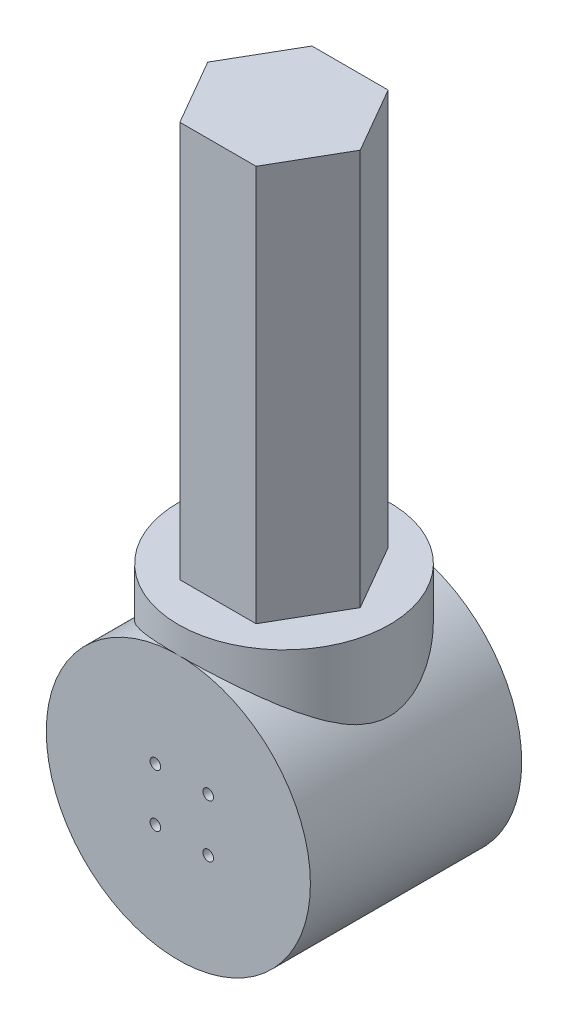
ISO-10303-21;
HEADER;
FILE_DESCRIPTION(('STEP AP214'),'2;1');
FILE_NAME('part.step','',(''),(''),'','','');
FILE_SCHEMA(('AUTOMOTIVE_DESIGN { 1 0 10303 214 1 1 1 1 }'));
ENDSEC;
DATA;
#1=APPLICATION_CONTEXT('core data for automotive mechanical design processes');
#2=APPLICATION_PROTOCOL_DEFINITION('international standard','automotive_design',2000,#1);
#3=PRODUCT_CONTEXT('',#1,'mechanical');
#4=PRODUCT('Part','Part','',(#3));
#5=PRODUCT_RELATED_PRODUCT_CATEGORY('part','',(#4));
#6=PRODUCT_DEFINITION_FORMATION('','',#4);
#7=PRODUCT_DEFINITION_CONTEXT('part definition',#1,'design');
#8=PRODUCT_DEFINITION('design','',#6,#7);
#9=PRODUCT_DEFINITION_SHAPE('','',#8);
#10=(LENGTH_UNIT() NAMED_UNIT(*) SI_UNIT(.MILLI.,.METRE.));
#11=(NAMED_UNIT(*) PLANE_ANGLE_UNIT() SI_UNIT($,.RADIAN.));
#12=(NAMED_UNIT(*) SI_UNIT($,.STERADIAN.) SOLID_ANGLE_UNIT());
#13=UNCERTAINTY_MEASURE_WITH_UNIT(LENGTH_MEASURE(1.E-05),#10,'distance_accuracy_value','');
#14=(GEOMETRIC_REPRESENTATION_CONTEXT(3) GLOBAL_UNCERTAINTY_ASSIGNED_CONTEXT((#13)) GLOBAL_UNIT_ASSIGNED_CONTEXT((#10,
#11,#12)) REPRESENTATION_CONTEXT('',''));
#15=CARTESIAN_POINT('',(0.,0.,0.));
#16=DIRECTION('',(0.,0.,1.));
#17=DIRECTION('',(1.,0.,0.));
#18=AXIS2_PLACEMENT_3D('',#15,#16,#17);
#19=CARTESIAN_POINT('',(0.,5.,0.));
#20=DIRECTION('',(0.,1.,0.));
#21=DIRECTION('',(0.,0.,1.));
#22=AXIS2_PLACEMENT_3D('',#19,#20,#21);
#23=PLANE('',#22);
#24=CARTESIAN_POINT('',(0.,5.,20.));
#25=DIRECTION('',(0.,1.,0.));
#26=DIRECTION('',(0.,0.,1.));
#27=AXIS2_PLACEMENT_3D('',#24,#25,#26);
#28=CIRCLE('',#27,20.);
#29=CARTESIAN_POINT('',(6.65437719316509,5.,38.8605213122831));
#30=VERTEX_POINT('',#29);
#31=CARTESIAN_POINT('',(6.65437719316509,5.,1.13947868771692));
#32=VERTEX_POINT('',#31);
#33=EDGE_CURVE('E152',#30,#32,#28,.T.);
#34=ORIENTED_EDGE('',*,*,#33,.F.);
#35=DIRECTION('',(0.,0.,-1.));
#36=VECTOR('',#35,1.);
#37=CARTESIAN_POINT('',(6.65437719316509,5.,50.));
#38=LINE('',#37,#36);
#39=EDGE_CURVE('E12',#30,#32,#38,.T.);
#40=ORIENTED_EDGE('',*,*,#39,.T.);
#41=EDGE_LOOP('',(#34,#40));
#42=FACE_BOUND('',#41,.T.);
#43=ADVANCED_FACE('F54',(#42),#23,.F.);
#44=CARTESIAN_POINT('',(4.65437719316508,5.,0.549118967415774));
#45=VERTEX_POINT('',#44);
#46=CARTESIAN_POINT('',(-3.34562280683491,5.,0.281815295662076));
#47=VERTEX_POINT('',#46);
#48=EDGE_CURVE('E146',#45,#47,#28,.T.);
#49=ORIENTED_EDGE('',*,*,#48,.F.);
#50=DIRECTION('',(0.,0.,-1.));
#51=VECTOR('',#50,1.);
#52=CARTESIAN_POINT('',(4.65437719316508,5.,50.));
#53=LINE('',#52,#51);
#54=CARTESIAN_POINT('',(4.65437719316508,5.,39.4508810325842));
#55=VERTEX_POINT('',#54);
#56=EDGE_CURVE('E63',#45,#55,#53,.F.);
#57=ORIENTED_EDGE('',*,*,#56,.T.);
#58=CARTESIAN_POINT('',(-3.34562280683491,5.,39.7181847043379));
#59=VERTEX_POINT('',#58);
#60=EDGE_CURVE('E150',#59,#55,#28,.T.);
#61=ORIENTED_EDGE('',*,*,#60,.F.);
#62=DIRECTION('',(0.,0.,-1.));
#63=VECTOR('',#62,1.);
#64=CARTESIAN_POINT('',(-3.34562280683491,5.,50.));
#65=LINE('',#64,#63);
#66=EDGE_CURVE('E137',#59,#47,#65,.T.);
#67=ORIENTED_EDGE('',*,*,#66,.T.);
#68=EDGE_LOOP('',(#49,#57,#61,#67));
#69=FACE_BOUND('',#68,.T.);
#70=ADVANCED_FACE('F159',(#69),#23,.F.);
#71=CARTESIAN_POINT('',(0.,30.,20.));
#72=DIRECTION('',(0.,-1.,0.));
#73=DIRECTION('',(0.,0.,-1.));
#74=AXIS2_PLACEMENT_3D('',#71,#72,#73);
#75=CYLINDRICAL_SURFACE('',#74,20.);
#76=CARTESIAN_POINT('',(0.,30.,20.));
#77=DIRECTION('',(0.,1.,0.));
#78=DIRECTION('',(0.,0.,1.));
#79=AXIS2_PLACEMENT_3D('',#76,#77,#78);
#80=CIRCLE('',#79,20.);
#81=CARTESIAN_POINT('',(0.,30.,40.));
#82=VERTEX_POINT('',#81);
#83=EDGE_CURVE('E138',#82,#82,#80,.T.);
#84=ORIENTED_EDGE('',*,*,#83,.F.);
#85=EDGE_LOOP('',(#84));
#86=FACE_BOUND('',#85,.T.);
#87=ORIENTED_EDGE('',*,*,#60,.T.);
#88=CARTESIAN_POINT('',(4.65437719316508,5.,39.4508810325842));
#89=CARTESIAN_POINT('',(4.65437698904075,5.02753735351361,39.4508807393084));
#90=CARTESIAN_POINT('',(4.65551540308977,5.05506135358367,39.4506087094051));
#91=CARTESIAN_POINT('',(4.66005438723276,5.10990884409998,39.4495218749936));
#92=CARTESIAN_POINT('',(4.66345474881793,5.13723235279305,39.4487071205144));
#93=CARTESIAN_POINT('',(4.67700608137124,5.21852689540365,39.4454546327142));
#94=CARTESIAN_POINT('',(4.6905074568628,5.2719474912021,39.4422086621465));
#95=CARTESIAN_POINT('',(4.72600768730722,5.3756871688573,39.4336095612349));
#96=CARTESIAN_POINT('',(4.74800871197149,5.42600545497905,39.4282558928508));
#97=CARTESIAN_POINT('',(4.79979643499983,5.52218111765433,39.4155263244014));
#98=CARTESIAN_POINT('',(4.82958286469294,5.5680386480717,39.4081504941195));
#99=CARTESIAN_POINT('',(4.89634575113298,5.65452541895001,39.3914153875061));
#100=CARTESIAN_POINT('',(4.93339213994244,5.6950968473704,39.3820367329587));
#101=CARTESIAN_POINT('',(5.01334570461199,5.76945459945473,39.3615099071017));
#102=CARTESIAN_POINT('',(5.05625425204457,5.80323933064791,39.3503613215812));
#103=CARTESIAN_POINT('',(5.1478670639642,5.86403023374415,39.3261937146641));
#104=CARTESIAN_POINT('',(5.19669400940187,5.89083492290209,39.3131332364764));
#105=CARTESIAN_POINT('',(5.29778049164405,5.93589665801189,39.2856491918277));
#106=CARTESIAN_POINT('',(5.35004037283934,5.95415284488349,39.2712254885446));
#107=CARTESIAN_POINT('',(5.4583487929666,5.98224535458904,39.2408340101877));
#108=CARTESIAN_POINT('',(5.51446556812351,5.99178027880034,39.2248307651148));
#109=CARTESIAN_POINT('',(5.62729911981374,6.00123613890853,39.1921066406619));
#110=CARTESIAN_POINT('',(5.68401601530409,6.00115513161571,39.1753856169156));
#111=CARTESIAN_POINT('',(5.79819016057351,5.99130996348875,39.1411766529833));
#112=CARTESIAN_POINT('',(5.85562078037027,5.98126354086491,39.123680566847));
#113=CARTESIAN_POINT('',(5.96794471671274,5.95134338254291,39.0889259778114));
#114=CARTESIAN_POINT('',(6.02283775537637,5.93146857334516,39.0716675010766));
#115=CARTESIAN_POINT('',(6.12900939816224,5.88214517810352,39.037814403338));
#116=CARTESIAN_POINT('',(6.18025210855561,5.85261421277449,39.02122692608));
#117=CARTESIAN_POINT('',(6.27703201550359,5.78472492189118,38.9895093500462));
#118=CARTESIAN_POINT('',(6.32256995012145,5.74636774006621,38.9743790628031));
#119=CARTESIAN_POINT('',(6.40541027393086,5.66281645993456,38.9465718792193));
#120=CARTESIAN_POINT('',(6.44288637502433,5.61781183926765,38.9338441634584));
#121=CARTESIAN_POINT('',(6.50965176904162,5.52147519992869,38.9109937358749));
#122=CARTESIAN_POINT('',(6.5389409230124,5.47014307388431,38.9008710682669));
#123=CARTESIAN_POINT('',(6.58691807320016,5.3654042175598,38.8842030618541));
#124=CARTESIAN_POINT('',(6.60606529711606,5.31223180335218,38.8775033633598));
#125=CARTESIAN_POINT('',(6.63513436972362,5.20318578097454,38.8673059676915));
#126=CARTESIAN_POINT('',(6.64507530096396,5.1473180138585,38.863801647459));
#127=CARTESIAN_POINT('',(6.65160911142932,5.07590596474208,38.8614977158815));
#128=CARTESIAN_POINT('',(6.6526475146563,5.06073374597513,38.861131483582));
#129=CARTESIAN_POINT('',(6.65403052698308,5.03037646794722,38.8606436535653));
#130=CARTESIAN_POINT('',(6.65437616914523,5.01519146163822,38.8605216915863));
#131=CARTESIAN_POINT('',(6.65437719316509,5.,38.8605213122831));
#132=B_SPLINE_CURVE_WITH_KNOTS('',3,(#88,#89,#90,#91,#92,#93,#94,#95,#96,#97,#98,#99,#100,#101,
#102,#103,#104,#105,#106,#107,#108,#109,#110,#111,#112,#113,#114,#115,#116,#117,#118,#119,#120,
#121,#122,#123,#124,#125,#126,#127,#128,#129,#130,#131),.UNSPECIFIED.,.F.,.F.,(4,2,2,2,2,2,2,2,
2,2,2,2,2,2,2,2,2,2,2,2,2,4),(0.,0.082560757327637,0.165113905168911,0.329848411450997,
0.494624997442165,0.659395897815243,0.825839772301492,0.992322656659504,1.16318088976688,
1.33405628955971,1.51063554693408,1.68725048754715,1.8690149707988,2.0507993115527,
2.23417683476518,2.41753060870173,2.59641432912147,2.7753010854625,2.94518764906976,
3.11472128316357,3.16034643407439,3.20590349686353),.UNSPECIFIED.);
#133=EDGE_CURVE('E78',#55,#30,#132,.T.);
#134=ORIENTED_EDGE('',*,*,#133,.T.);
#135=ORIENTED_EDGE('',*,*,#33,.T.);
#136=CARTESIAN_POINT('',(6.65437719316509,5.,1.13947868771692));
#137=CARTESIAN_POINT('',(6.65437782980631,5.02702875621855,1.13947926244969));
#138=CARTESIAN_POINT('',(6.65328061709714,5.05404406721382,1.13909175635731));
#139=CARTESIAN_POINT('',(6.64890886540435,5.10787108717305,1.13755002921993));
#140=CARTESIAN_POINT('',(6.64563471799035,5.13468283187582,1.13639594606072));
#141=CARTESIAN_POINT('',(6.6326023486216,5.21438791863811,1.13180782604782));
#142=CARTESIAN_POINT('',(6.61963391933443,5.26673040318935,1.1272477833596));
#143=CARTESIAN_POINT('',(6.58561533973417,5.36833431486864,1.11535039915009));
#144=CARTESIAN_POINT('',(6.56456651665822,5.41759624644541,1.10801351373916));
#145=CARTESIAN_POINT('',(6.51511189755682,5.51182727787507,1.09090167838977));
#146=CARTESIAN_POINT('',(6.48670388541638,5.55679507901942,1.08112599407458));
#147=CARTESIAN_POINT('',(6.42259836543154,5.64247489868949,1.05926603151177));
#148=CARTESIAN_POINT('',(6.38672954200933,5.68304474036778,1.04712803080062));
#149=CARTESIAN_POINT('',(6.30925223350421,5.75764959629631,1.02119593510876));
#150=CARTESIAN_POINT('',(6.26764203051715,5.79168264732586,1.00740134461312));
#151=CARTESIAN_POINT('',(6.177483562371,5.85412059788916,0.977879736886838));
#152=CARTESIAN_POINT('',(6.12868530457797,5.88213466155409,0.96208920728144));
#153=CARTESIAN_POINT('',(6.02730366170307,5.9295478622559,0.929749826174092));
#154=CARTESIAN_POINT('',(5.97471961131936,5.94894548075355,0.913200841570551));
#155=CARTESIAN_POINT('',(5.86496874791001,5.97929569090168,0.879184939511018));
#156=CARTESIAN_POINT('',(5.80770275573244,5.9898793620644,0.861707786497243));
#157=CARTESIAN_POINT('',(5.69211917134828,6.0009730169507,0.827013252267888));
#158=CARTESIAN_POINT('',(5.63380145315293,6.00148178564639,0.809795902634648));
#159=CARTESIAN_POINT('',(5.51717499505016,5.99228510927127,0.775939499653491));
#160=CARTESIAN_POINT('',(5.4588719239176,5.98247969411093,0.759307751219548));
#161=CARTESIAN_POINT('',(5.34459316997904,5.95263857905899,0.727251192897117));
#162=CARTESIAN_POINT('',(5.28861728289101,5.93260377916993,0.711826276966661));
#163=CARTESIAN_POINT('',(5.1818076491802,5.88321698837067,0.682860581313832));
#164=CARTESIAN_POINT('',(5.13089502279754,5.85405393552665,0.669288972689685));
#165=CARTESIAN_POINT('',(5.03465550882933,5.78700820453765,0.644000358253814));
#166=CARTESIAN_POINT('',(4.98932733016113,5.74912754766775,0.63228292359206));
#167=CARTESIAN_POINT('',(4.90722139579132,5.66709244756803,0.611319861689487));
#168=CARTESIAN_POINT('',(4.87020642876086,5.62319332142133,0.602004076347629));
#169=CARTESIAN_POINT('',(4.80407890127805,5.52941715200944,0.585521081732699));
#170=CARTESIAN_POINT('',(4.77496735161987,5.4795393452858,0.578354147271046));
#171=CARTESIAN_POINT('',(4.72644432970642,5.37691572493073,0.566489483086359));
#172=CARTESIAN_POINT('',(4.70676133822298,5.32430584256275,0.561722404982962));
#173=CARTESIAN_POINT('',(4.67647997565809,5.21643387153472,0.554414843487355));
#174=CARTESIAN_POINT('',(4.66586644642023,5.16117637187016,0.551870644747146));
#175=CARTESIAN_POINT('',(4.6580946169941,5.08794234481766,0.550008852705235));
#176=CARTESIAN_POINT('',(4.65669997677626,5.07036921247683,0.549674921895952));
#177=CARTESIAN_POINT('',(4.65484256026103,5.03519988039116,0.549230291668295));
#178=CARTESIAN_POINT('',(4.65437825684407,5.01760376596919,0.549119226422442));
#179=CARTESIAN_POINT('',(4.65437719316508,5.,0.549118967415774));
#180=B_SPLINE_CURVE_WITH_KNOTS('',3,(#136,#137,#138,#139,#140,#141,#142,#143,#144,#145,#146,
#147,#148,#149,#150,#151,#152,#153,#154,#155,#156,#157,#158,#159,#160,#161,#162,#163,#164,#165,
#166,#167,#168,#169,#170,#171,#172,#173,#174,#175,#176,#177,#178,#179),.UNSPECIFIED.,.F.,.F.,(4,
2,2,2,2,2,2,2,2,2,2,2,2,2,2,2,2,2,2,2,2,4),(0.,0.08103479243685,0.162055012924865,
0.323564650075971,0.485047769963145,0.64657957483479,0.812338812889844,0.978147756506928,
1.15268966028139,1.32726231266119,1.50881932444096,1.69039823176684,1.87375344994852,
2.05709253893606,2.23686314984311,2.4165921208209,2.59024652261634,2.76392312319611,
2.93224228500356,3.10027957491755,3.1531559757032,3.20594551014779),.UNSPECIFIED.);
#181=EDGE_CURVE('E147',#32,#45,#180,.T.);
#182=ORIENTED_EDGE('',*,*,#181,.T.);
#183=ORIENTED_EDGE('',*,*,#48,.T.);
#184=CARTESIAN_POINT('',(-3.34562280683491,5.,0.281815295662076));
#185=CARTESIAN_POINT('',(-3.34562279111528,5.02781982026018,0.281815634573323));
#186=CARTESIAN_POINT('',(-3.34678446940353,5.05562623918763,0.282012359172661));
#187=CARTESIAN_POINT('',(-3.35141752163558,5.11103844871247,0.282799165446812));
#188=CARTESIAN_POINT('',(-3.3548887376301,5.13864425289939,0.283389220221781));
#189=CARTESIAN_POINT('',(-3.36872871928119,5.22080082935982,0.285747286736273));
#190=CARTESIAN_POINT('',(-3.38252393952714,5.27479853211416,0.288103200261892));
#191=CARTESIAN_POINT('',(-3.41883558462511,5.37967115573433,0.294368863297387));
#192=CARTESIAN_POINT('',(-3.44135522154479,5.43054491845829,0.298279185107453));
#193=CARTESIAN_POINT('',(-3.49442607713449,5.52775828995684,0.307623061071305));
#194=CARTESIAN_POINT('',(-3.52497629973974,5.57409846007309,0.313056426321634));
#195=CARTESIAN_POINT('',(-3.59335804200622,5.66119511294957,0.325422818122046));
#196=CARTESIAN_POINT('',(-3.63122478577505,5.70192288139652,0.332363120412639));
#197=CARTESIAN_POINT('',(-3.7130185949197,5.77644952925574,0.347640832231609));
#198=CARTESIAN_POINT('',(-3.75694684463641,5.81024705137025,0.355978514858752));
#199=CARTESIAN_POINT('',(-3.8502110100016,5.87045348180864,0.37404377086176));
#200=CARTESIAN_POINT('',(-3.89961192121612,5.89675648818167,0.383788587668114));
#201=CARTESIAN_POINT('',(-4.00189676262776,5.94071884001265,0.404399919875718));
#202=CARTESIAN_POINT('',(-4.0547807982301,5.95837792375443,0.415266469228141));
#203=CARTESIAN_POINT('',(-4.16357701463044,5.98491263751984,0.4381040994068));
#204=CARTESIAN_POINT('',(-4.21952743233657,5.99361690525573,0.450092104157147));
#205=CARTESIAN_POINT('',(-4.33196007959829,6.00149403734255,0.474697578641917));
#206=CARTESIAN_POINT('',(-4.38844238016746,6.00066561039158,0.487315133424895));
#207=CARTESIAN_POINT('',(-4.50141332129313,5.98944871953846,0.513063501002705));
#208=CARTESIAN_POINT('',(-4.55788377792185,5.97888845380914,0.526199464289402));
#209=CARTESIAN_POINT('',(-4.66821939627345,5.94826680460189,0.552353745803115));
#210=CARTESIAN_POINT('',(-4.72208437288506,5.92820474714061,0.565372055617942));
#211=CARTESIAN_POINT('',(-4.82605616815555,5.87892868259707,0.59092816731324));
#212=CARTESIAN_POINT('',(-4.87613480826783,5.84965310834097,0.603462080388338));
#213=CARTESIAN_POINT('',(-4.97065064153651,5.78274625678067,0.627467563116349));
#214=CARTESIAN_POINT('',(-5.01508834045797,5.74511572941185,0.638939227985123));
#215=CARTESIAN_POINT('',(-5.09638939162184,5.66305377295415,0.660181992729747));
#216=CARTESIAN_POINT('',(-5.13334755430007,5.61872181903328,0.669974102529632));
#217=CARTESIAN_POINT('',(-5.19924290315776,5.52407610847315,0.687593592555037));
#218=CARTESIAN_POINT('',(-5.22817889634783,5.47376146372658,0.695420680542755));
#219=CARTESIAN_POINT('',(-5.27625813106952,5.37024079181327,0.708506939471839));
#220=CARTESIAN_POINT('',(-5.29567256906399,5.31716933803026,0.71383700366642));
#221=CARTESIAN_POINT('',(-5.32528642508545,5.20838399624347,0.721992707227597));
#222=CARTESIAN_POINT('',(-5.33550296948105,5.15267522342343,0.724823000949891));
#223=CARTESIAN_POINT('',(-5.34250902298951,5.08049859831101,0.726764735191754));
#224=CARTESIAN_POINT('',(-5.34367717613084,5.06440956537913,0.727088590673051));
#225=CARTESIAN_POINT('',(-5.34523295389103,5.03221591696014,0.727519982676024));
#226=CARTESIAN_POINT('',(-5.34562178683335,5.01611136439039,0.72762785407729));
#227=CARTESIAN_POINT('',(-5.34562280683492,5.,0.7276281478629));
#228=B_SPLINE_CURVE_WITH_KNOTS('',3,(#184,#185,#186,#187,#188,#189,#190,#191,#192,#193,#194,
#195,#196,#197,#198,#199,#200,#201,#202,#203,#204,#205,#206,#207,#208,#209,#210,#211,#212,#213,
#214,#215,#216,#217,#218,#219,#220,#221,#222,#223,#224,#225,#226,#227),.UNSPECIFIED.,.F.,.F.,(4,
2,2,2,2,2,2,2,2,2,2,2,2,2,2,2,2,2,2,2,2,4),(0.,0.0834079399840966,0.16681017628549,
0.333295484994862,0.499842146924104,0.666368161162421,0.833716814758871,1.00109821256788,
1.17073917992907,1.3403852832732,1.51322058847143,1.68607930627164,1.86204929185637,
2.03803176125571,2.21521609638428,2.39238453398206,2.56714296543119,2.74192737155722,
2.91139314646895,3.08054272157075,3.12893323511549,3.17724866172263),.UNSPECIFIED.);
#229=CARTESIAN_POINT('',(-5.34562280683492,5.,0.7276281478629));
#230=VERTEX_POINT('',#229);
#231=EDGE_CURVE('E132',#47,#230,#228,.T.);
#232=ORIENTED_EDGE('',*,*,#231,.T.);
#233=CARTESIAN_POINT('',(-5.34562280683492,5.,39.2723718521371));
#234=VERTEX_POINT('',#233);
#235=EDGE_CURVE('E143',#230,#234,#28,.T.);
#236=ORIENTED_EDGE('',*,*,#235,.T.);
#237=CARTESIAN_POINT('',(-5.34562280683492,5.,39.2723718521371));
#238=CARTESIAN_POINT('',(-5.34562316109101,5.02743411753709,39.2723714065399));
#239=CARTESIAN_POINT('',(-5.34449311481104,5.05485477424719,39.2726852349133));
#240=CARTESIAN_POINT('',(-5.33998849674468,5.10949319985591,39.2739339773359));
#241=CARTESIAN_POINT('',(-5.33661422521898,5.13671099540331,39.2748688082995));
#242=CARTESIAN_POINT('',(-5.32317329327205,5.21766107710808,39.2785870280794));
#243=CARTESIAN_POINT('',(-5.30978831049794,5.27084024119709,39.2822842305676));
#244=CARTESIAN_POINT('',(-5.27461905983431,5.37409275037629,39.2919341104226));
#245=CARTESIAN_POINT('',(-5.25283435191293,5.42416593259552,39.2978869059516));
#246=CARTESIAN_POINT('',(-5.20156755518159,5.51991027452159,39.3117683739185));
#247=CARTESIAN_POINT('',(-5.17208442467345,5.56558083734996,39.3196973137481));
#248=CARTESIAN_POINT('',(-5.10574165516629,5.65210685899247,39.3373368623876));
#249=CARTESIAN_POINT('',(-5.06876297206702,5.69286509157602,39.3470759813703));
#250=CARTESIAN_POINT('',(-4.98883166328335,5.76764521360802,39.3678409131532));
#251=CARTESIAN_POINT('',(-4.94587750596533,5.80166537051682,39.3788670557264));
#252=CARTESIAN_POINT('',(-4.85366184222336,5.86317342633224,39.4021725215835));
#253=CARTESIAN_POINT('',(-4.80423863433088,5.89040786201882,39.414481243168));
#254=CARTESIAN_POINT('',(-4.70163041469912,5.93617053999694,39.4395848712438));
#255=CARTESIAN_POINT('',(-4.64844509349619,5.95469806511564,39.4523798176908));
#256=CARTESIAN_POINT('',(-4.53848519732732,5.98290311299216,39.4783318805087));
#257=CARTESIAN_POINT('',(-4.48165626053077,5.99236775873059,39.4914905692944));
#258=CARTESIAN_POINT('',(-4.36713615389493,6.00141733641135,39.5174683094863));
#259=CARTESIAN_POINT('',(-4.30944493047673,6.0010016518589,39.530287339649));
#260=CARTESIAN_POINT('',(-4.19467652885198,5.99022524990883,39.5552588153184));
#261=CARTESIAN_POINT('',(-4.13760152022959,5.97983671134247,39.5674092954956));
#262=CARTESIAN_POINT('',(-4.02591194483755,5.94928194219872,39.590693926006));
#263=CARTESIAN_POINT('',(-3.97129720701282,5.92911639253718,39.6018281470521));
#264=CARTESIAN_POINT('',(-3.86692326632883,5.87984705565768,39.6226833255097));
#265=CARTESIAN_POINT('',(-3.8171071808507,5.85087124335974,39.6324217571258));
#266=CARTESIAN_POINT('',(-3.72302338794351,5.78465135013384,39.650480770665));
#267=CARTESIAN_POINT('',(-3.67875483719154,5.74740852832814,39.6588015681628));
#268=CARTESIAN_POINT('',(-3.59798058144222,5.66650879304986,39.6737437618729));
#269=CARTESIAN_POINT('',(-3.56133810635898,5.62299403208536,39.6803956400687));
#270=CARTESIAN_POINT('',(-3.49586787265894,5.53022514561906,39.6921308698194));
#271=CARTESIAN_POINT('',(-3.46704180452975,5.48096978186085,39.6972138821018));
#272=CARTESIAN_POINT('',(-3.4185273572125,5.37899142152861,39.7056913076655));
#273=CARTESIAN_POINT('',(-3.39870116313876,5.32633589818599,39.7091112499294));
#274=CARTESIAN_POINT('',(-3.36816256220606,5.21841576482438,39.7143532775857));
#275=CARTESIAN_POINT('',(-3.35743584360752,5.1631553967915,39.7161778722949));
#276=CARTESIAN_POINT('',(-3.34948131858851,5.08959217923721,39.7175296669425));
#277=CARTESIAN_POINT('',(-3.34803368509325,5.07168942402853,39.7177755043443));
#278=CARTESIAN_POINT('',(-3.34610575572249,5.03586027926182,39.7181027938379));
#279=CARTESIAN_POINT('',(-3.34562385295988,5.01793397870994,39.7181845189979));
#280=CARTESIAN_POINT('',(-3.34562280683491,5.,39.7181847043379));
#281=B_SPLINE_CURVE_WITH_KNOTS('',3,(#237,#238,#239,#240,#241,#242,#243,#244,#245,#246,#247,
#248,#249,#250,#251,#252,#253,#254,#255,#256,#257,#258,#259,#260,#261,#262,#263,#264,#265,#266,
#267,#268,#269,#270,#271,#272,#273,#274,#275,#276,#277,#278,#279,#280),.UNSPECIFIED.,.F.,.F.,(4,
2,2,2,2,2,2,2,2,2,2,2,2,2,2,2,2,2,2,2,2,4),(0.,0.0822507317706778,0.164490461216687,
0.328525222479001,0.492568578109322,0.656634142484128,0.823544611516721,0.99049794214225,
1.16297690831505,1.33547007878651,1.51192216261382,1.68838525640437,1.86534206236016,
2.04228654600304,2.2167745334749,2.39123596344158,2.56223083570688,2.73326266031806,
2.90157896587899,3.06963004855415,3.12349968626031,3.1772796151727),.UNSPECIFIED.);
#282=EDGE_CURVE('E70',#234,#59,#281,.T.);
#283=ORIENTED_EDGE('',*,*,#282,.T.);
#284=EDGE_LOOP('',(#87,#134,#135,#182,#183,#232,#236,#283));
#285=FACE_BOUND('',#284,.T.);
#286=ADVANCED_FACE('F56',(#86,#285),#75,.T.);
#287=CARTESIAN_POINT('',(0.,30.,0.));
#288=DIRECTION('',(0.,1.,0.));
#289=DIRECTION('',(0.,0.,1.));
#290=AXIS2_PLACEMENT_3D('',#287,#288,#289);
#291=PLANE('',#290);
#292=DIRECTION('',(0.5,0.,-0.866025403784439));
#293=VECTOR('',#292,1.);
#294=CARTESIAN_POINT('',(19.4855715851499,30.,11.25));
#295=LINE('',#294,#293);
#296=CARTESIAN_POINT('',(7.21687836487033,30.,32.5));
#297=VERTEX_POINT('',#296);
#298=CARTESIAN_POINT('',(14.4337567297407,30.,20.));
#299=VERTEX_POINT('',#298);
#300=EDGE_CURVE('E255',#297,#299,#295,.T.);
#301=ORIENTED_EDGE('',*,*,#300,.F.);
#302=DIRECTION('',(1.,0.,0.));
#303=VECTOR('',#302,1.);
#304=CARTESIAN_POINT('',(0.,30.,32.5));
#305=LINE('',#304,#303);
#306=CARTESIAN_POINT('',(-7.21687836487032,30.,32.5));
#307=VERTEX_POINT('',#306);
#308=EDGE_CURVE('E270',#307,#297,#305,.T.);
#309=ORIENTED_EDGE('',*,*,#308,.F.);
#310=DIRECTION('',(0.5,0.,0.866025403784439));
#311=VECTOR('',#310,1.);
#312=CARTESIAN_POINT('',(-19.4855715851499,30.,11.25));
#313=LINE('',#312,#311);
#314=CARTESIAN_POINT('',(-14.4337567297407,30.,20.));
#315=VERTEX_POINT('',#314);
#316=EDGE_CURVE('E267',#315,#307,#313,.T.);
#317=ORIENTED_EDGE('',*,*,#316,.F.);
#318=DIRECTION('',(-0.5,0.,0.866025403784439));
#319=VECTOR('',#318,1.);
#320=CARTESIAN_POINT('',(-2.16506350946111,30.,-1.25000000000001));
#321=LINE('',#320,#319);
#322=CARTESIAN_POINT('',(-7.21687836487033,30.,7.49999999999999));
#323=VERTEX_POINT('',#322);
#324=EDGE_CURVE('E264',#323,#315,#321,.T.);
#325=ORIENTED_EDGE('',*,*,#324,.F.);
#326=DIRECTION('',(-1.,0.,0.));
#327=VECTOR('',#326,1.);
#328=CARTESIAN_POINT('',(0.,30.,7.49999999999999));
#329=LINE('',#328,#327);
#330=CARTESIAN_POINT('',(7.21687836487033,30.,7.49999999999999));
#331=VERTEX_POINT('',#330);
#332=EDGE_CURVE('E261',#331,#323,#329,.T.);
#333=ORIENTED_EDGE('',*,*,#332,.F.);
#334=DIRECTION('',(-0.5,0.,-0.866025403784439));
#335=VECTOR('',#334,1.);
#336=CARTESIAN_POINT('',(2.1650635094611,30.,-1.25));
#337=LINE('',#336,#335);
#338=EDGE_CURVE('E258',#299,#331,#337,.T.);
#339=ORIENTED_EDGE('',*,*,#338,.F.);
#340=EDGE_LOOP('',(#301,#309,#317,#325,#333,#339));
#341=FACE_BOUND('',#340,.T.);
#342=ORIENTED_EDGE('',*,*,#83,.T.);
#343=EDGE_LOOP('',(#342));
#344=FACE_BOUND('',#343,.T.);
#345=ADVANCED_FACE('F208',(#341,#344),#291,.T.);
#346=ORIENTED_EDGE('',*,*,#235,.F.);
#347=DIRECTION('',(0.,0.,-1.));
#348=VECTOR('',#347,1.);
#349=CARTESIAN_POINT('',(-5.34562280683492,5.,50.));
#350=LINE('',#349,#348);
#351=EDGE_CURVE('E129',#230,#234,#350,.F.);
#352=ORIENTED_EDGE('',*,*,#351,.T.);
#353=EDGE_LOOP('',(#346,#352));
#354=FACE_BOUND('',#353,.T.);
#355=ADVANCED_FACE('F149',(#354),#23,.F.);
#356=CARTESIAN_POINT('',(19.4855715851499,55.,11.25));
#357=DIRECTION('',(-0.866025403784439,0.,-0.5));
#358=DIRECTION('',(-0.5,0.,0.866025403784439));
#359=AXIS2_PLACEMENT_3D('',#356,#357,#358);
#360=PLANE('',#359);
#361=ORIENTED_EDGE('',*,*,#300,.T.);
#362=DIRECTION('',(0.,-1.,0.));
#363=VECTOR('',#362,1.);
#364=CARTESIAN_POINT('',(14.4337567297407,55.,20.));
#365=LINE('',#364,#363);
#366=CARTESIAN_POINT('',(14.4337567297407,105.,20.));
#367=VERTEX_POINT('',#366);
#368=EDGE_CURVE('E153',#367,#299,#365,.T.);
#369=ORIENTED_EDGE('',*,*,#368,.F.);
#370=DIRECTION('',(0.499999999999999,0.,-0.866025403784439));
#371=VECTOR('',#370,1.);
#372=CARTESIAN_POINT('',(7.21687836487033,105.,32.5));
#373=LINE('',#372,#371);
#374=CARTESIAN_POINT('',(7.21687836487033,105.,32.5));
#375=VERTEX_POINT('',#374);
#376=EDGE_CURVE('E240',#375,#367,#373,.T.);
#377=ORIENTED_EDGE('',*,*,#376,.F.);
#378=DIRECTION('',(0.,-1.,0.));
#379=VECTOR('',#378,1.);
#380=CARTESIAN_POINT('',(7.21687836487033,55.,32.5));
#381=LINE('',#380,#379);
#382=EDGE_CURVE('E273',#375,#297,#381,.T.);
#383=ORIENTED_EDGE('',*,*,#382,.T.);
#384=EDGE_LOOP('',(#361,#369,#377,#383));
#385=FACE_BOUND('',#384,.T.);
#386=ADVANCED_FACE('F203',(#385),#360,.F.);
#387=CARTESIAN_POINT('',(2.1650635094611,55.,-1.25));
#388=DIRECTION('',(-0.866025403784439,0.,0.5));
#389=DIRECTION('',(0.5,0.,0.866025403784439));
#390=AXIS2_PLACEMENT_3D('',#387,#388,#389);
#391=PLANE('',#390);
#392=ORIENTED_EDGE('',*,*,#338,.T.);
#393=DIRECTION('',(0.,-1.,0.));
#394=VECTOR('',#393,1.);
#395=CARTESIAN_POINT('',(7.21687836487033,55.,7.49999999999999));
#396=LINE('',#395,#394);
#397=CARTESIAN_POINT('',(7.21687836487027,105.,7.49999999999996));
#398=VERTEX_POINT('',#397);
#399=EDGE_CURVE('E285',#398,#331,#396,.T.);
#400=ORIENTED_EDGE('',*,*,#399,.F.);
#401=DIRECTION('',(-0.500000000000003,0.,-0.866025403784437));
#402=VECTOR('',#401,1.);
#403=CARTESIAN_POINT('',(14.4337567297407,105.,20.));
#404=LINE('',#403,#402);
#405=EDGE_CURVE('E243',#367,#398,#404,.T.);
#406=ORIENTED_EDGE('',*,*,#405,.F.);
#407=ORIENTED_EDGE('',*,*,#368,.T.);
#408=EDGE_LOOP('',(#392,#400,#406,#407));
#409=FACE_BOUND('',#408,.T.);
#410=ADVANCED_FACE('F199',(#409),#391,.F.);
#411=CARTESIAN_POINT('',(0.,55.,7.49999999999999));
#412=DIRECTION('',(0.,0.,1.));
#413=DIRECTION('',(1.,0.,0.));
#414=AXIS2_PLACEMENT_3D('',#411,#412,#413);
#415=PLANE('',#414);
#416=ORIENTED_EDGE('',*,*,#332,.T.);
#417=DIRECTION('',(0.,-1.,0.));
#418=VECTOR('',#417,1.);
#419=CARTESIAN_POINT('',(-7.21687836487033,55.,7.49999999999999));
#420=LINE('',#419,#418);
#421=CARTESIAN_POINT('',(-7.21687836487042,105.,7.50000000000004));
#422=VERTEX_POINT('',#421);
#423=EDGE_CURVE('E282',#422,#323,#420,.T.);
#424=ORIENTED_EDGE('',*,*,#423,.F.);
#425=DIRECTION('',(-1.,0.,0.));
#426=VECTOR('',#425,1.);
#427=CARTESIAN_POINT('',(7.21687836487027,105.,7.49999999999996));
#428=LINE('',#427,#426);
#429=EDGE_CURVE('E246',#398,#422,#428,.T.);
#430=ORIENTED_EDGE('',*,*,#429,.F.);
#431=ORIENTED_EDGE('',*,*,#399,.T.);
#432=EDGE_LOOP('',(#416,#424,#430,#431));
#433=FACE_BOUND('',#432,.T.);
#434=ADVANCED_FACE('F195',(#433),#415,.F.);
#435=CARTESIAN_POINT('',(-2.16506350946111,55.,-1.25000000000001));
#436=DIRECTION('',(0.866025403784439,0.,0.5));
#437=DIRECTION('',(0.5,0.,-0.866025403784439));
#438=AXIS2_PLACEMENT_3D('',#435,#436,#437);
#439=PLANE('',#438);
#440=ORIENTED_EDGE('',*,*,#324,.T.);
#441=DIRECTION('',(0.,-1.,0.));
#442=VECTOR('',#441,1.);
#443=CARTESIAN_POINT('',(-14.4337567297407,55.,20.));
#444=LINE('',#443,#442);
#445=CARTESIAN_POINT('',(-14.4337567297407,105.,20.0000000000001));
#446=VERTEX_POINT('',#445);
#447=EDGE_CURVE('E279',#446,#315,#444,.T.);
#448=ORIENTED_EDGE('',*,*,#447,.F.);
#449=DIRECTION('',(-0.499999999999993,0.,0.866025403784443));
#450=VECTOR('',#449,1.);
#451=CARTESIAN_POINT('',(-7.21687836487042,105.,7.50000000000004));
#452=LINE('',#451,#450);
#453=EDGE_CURVE('E249',#422,#446,#452,.T.);
#454=ORIENTED_EDGE('',*,*,#453,.F.);
#455=ORIENTED_EDGE('',*,*,#423,.T.);
#456=EDGE_LOOP('',(#440,#448,#454,#455));
#457=FACE_BOUND('',#456,.T.);
#458=ADVANCED_FACE('F191',(#457),#439,.F.);
#459=CARTESIAN_POINT('',(-19.4855715851499,55.,11.25));
#460=DIRECTION('',(0.866025403784439,0.,-0.5));
#461=DIRECTION('',(-0.5,0.,-0.866025403784439));
#462=AXIS2_PLACEMENT_3D('',#459,#460,#461);
#463=PLANE('',#462);
#464=ORIENTED_EDGE('',*,*,#316,.T.);
#465=DIRECTION('',(0.,-1.,0.));
#466=VECTOR('',#465,1.);
#467=CARTESIAN_POINT('',(-7.21687836487032,55.,32.5));
#468=LINE('',#467,#466);
#469=CARTESIAN_POINT('',(-7.21687836487018,105.,32.5000000000001));
#470=VERTEX_POINT('',#469);
#471=EDGE_CURVE('E276',#470,#307,#468,.T.);
#472=ORIENTED_EDGE('',*,*,#471,.F.);
#473=DIRECTION('',(0.500000000000009,0.,0.866025403784433));
#474=VECTOR('',#473,1.);
#475=CARTESIAN_POINT('',(-14.4337567297407,105.,20.0000000000001));
#476=LINE('',#475,#474);
#477=EDGE_CURVE('E252',#446,#470,#476,.T.);
#478=ORIENTED_EDGE('',*,*,#477,.F.);
#479=ORIENTED_EDGE('',*,*,#447,.T.);
#480=EDGE_LOOP('',(#464,#472,#478,#479));
#481=FACE_BOUND('',#480,.T.);
#482=ADVANCED_FACE('F187',(#481),#463,.F.);
#483=CARTESIAN_POINT('',(0.,55.,32.5));
#484=DIRECTION('',(0.,0.,-1.));
#485=DIRECTION('',(-1.,0.,0.));
#486=AXIS2_PLACEMENT_3D('',#483,#484,#485);
#487=PLANE('',#486);
#488=ORIENTED_EDGE('',*,*,#308,.T.);
#489=ORIENTED_EDGE('',*,*,#382,.F.);
#490=DIRECTION('',(1.,0.,0.));
#491=VECTOR('',#490,1.);
#492=CARTESIAN_POINT('',(-7.21687836487018,105.,32.5000000000001));
#493=LINE('',#492,#491);
#494=EDGE_CURVE('E227',#470,#375,#493,.T.);
#495=ORIENTED_EDGE('',*,*,#494,.F.);
#496=ORIENTED_EDGE('',*,*,#471,.T.);
#497=EDGE_LOOP('',(#488,#489,#495,#496));
#498=FACE_BOUND('',#497,.T.);
#499=ADVANCED_FACE('F183',(#498),#487,.F.);
#500=CARTESIAN_POINT('',(0.,105.,0.));
#501=DIRECTION('',(0.,1.,0.));
#502=DIRECTION('',(0.,0.,1.));
#503=AXIS2_PLACEMENT_3D('',#500,#501,#502);
#504=PLANE('',#503);
#505=ORIENTED_EDGE('',*,*,#494,.T.);
#506=ORIENTED_EDGE('',*,*,#376,.T.);
#507=ORIENTED_EDGE('',*,*,#405,.T.);
#508=ORIENTED_EDGE('',*,*,#429,.T.);
#509=ORIENTED_EDGE('',*,*,#453,.T.);
#510=ORIENTED_EDGE('',*,*,#477,.T.);
#511=EDGE_LOOP('',(#505,#506,#507,#508,#509,#510));
#512=FACE_BOUND('',#511,.T.);
#513=ADVANCED_FACE('F178',(#512),#504,.T.);
#514=CARTESIAN_POINT('',(-4.34562280683491,5.,50.));
#515=DIRECTION('',(0.,0.,-1.));
#516=DIRECTION('',(-1.,0.,0.));
#517=AXIS2_PLACEMENT_3D('',#514,#515,#516);
#518=CYLINDRICAL_SURFACE('',#517,1.);
#519=ORIENTED_EDGE('',*,*,#282,.F.);
#520=ORIENTED_EDGE('',*,*,#351,.F.);
#521=ORIENTED_EDGE('',*,*,#231,.F.);
#522=ORIENTED_EDGE('',*,*,#66,.F.);
#523=EDGE_LOOP('',(#519,#520,#521,#522));
#524=FACE_BOUND('',#523,.T.);
#525=ADVANCED_FACE('F131',(#524),#518,.F.);
#526=CARTESIAN_POINT('',(5.65437719316509,5.,50.));
#527=DIRECTION('',(0.,0.,-1.));
#528=DIRECTION('',(-1.,0.,0.));
#529=AXIS2_PLACEMENT_3D('',#526,#527,#528);
#530=CYLINDRICAL_SURFACE('',#529,1.);
#531=ORIENTED_EDGE('',*,*,#133,.F.);
#532=ORIENTED_EDGE('',*,*,#56,.F.);
#533=ORIENTED_EDGE('',*,*,#181,.F.);
#534=ORIENTED_EDGE('',*,*,#39,.F.);
#535=EDGE_LOOP('',(#531,#532,#533,#534));
#536=FACE_BOUND('',#535,.T.);
#537=ADVANCED_FACE('F177',(#536),#530,.F.);
#538=CLOSED_SHELL('',(#43,#70,#286,#345,#355,#386,#410,#434,#458,#482,#499,#513,#525,#537));
#539=MANIFOLD_SOLID_BREP('B2',#538);
#540=CARTESIAN_POINT('',(0.,0.,40.));
#541=DIRECTION('',(0.,0.,-1.));
#542=DIRECTION('',(-1.,0.,0.));
#543=AXIS2_PLACEMENT_3D('',#540,#541,#542);
#544=CYLINDRICAL_SURFACE('',#543,25.);
#545=CARTESIAN_POINT('',(0.,0.,40.));
#546=DIRECTION('',(0.,0.,1.));
#547=DIRECTION('',(1.,0.,0.));
#548=AXIS2_PLACEMENT_3D('',#545,#546,#547);
#549=CIRCLE('',#548,25.);
#550=CARTESIAN_POINT('',(25.,0.,40.));
#551=VERTEX_POINT('',#550);
#552=EDGE_CURVE('E53',#551,#551,#549,.T.);
#553=ORIENTED_EDGE('',*,*,#552,.F.);
#554=EDGE_LOOP('',(#553));
#555=FACE_BOUND('',#554,.T.);
#556=CARTESIAN_POINT('',(0.,0.,0.));
#557=DIRECTION('',(0.,0.,1.));
#558=DIRECTION('',(1.,0.,0.));
#559=AXIS2_PLACEMENT_3D('',#556,#557,#558);
#560=CIRCLE('',#559,25.);
#561=CARTESIAN_POINT('',(25.,0.,0.));
#562=VERTEX_POINT('',#561);
#563=EDGE_CURVE('E427',#562,#562,#560,.T.);
#564=ORIENTED_EDGE('',*,*,#563,.T.);
#565=EDGE_LOOP('',(#564));
#566=FACE_BOUND('',#565,.T.);
#567=ADVANCED_FACE('F424',(#555,#566),#544,.T.);
#568=CARTESIAN_POINT('',(0.,0.,40.));
#569=DIRECTION('',(0.,0.,1.));
#570=DIRECTION('',(1.,0.,0.));
#571=AXIS2_PLACEMENT_3D('',#568,#569,#570);
#572=PLANE('',#571);
#573=CARTESIAN_POINT('',(5.65437719316509,5.,40.));
#574=DIRECTION('',(0.,0.,1.));
#575=DIRECTION('',(1.,0.,0.));
#576=AXIS2_PLACEMENT_3D('',#573,#574,#575);
#577=CIRCLE('',#576,1.);
#578=CARTESIAN_POINT('',(6.65437719316509,5.,40.));
#579=VERTEX_POINT('',#578);
#580=EDGE_CURVE('E436',#579,#579,#577,.T.);
#581=ORIENTED_EDGE('',*,*,#580,.F.);
#582=EDGE_LOOP('',(#581));
#583=FACE_BOUND('',#582,.T.);
#584=CARTESIAN_POINT('',(-4.34562280683491,5.,40.));
#585=DIRECTION('',(0.,0.,1.));
#586=DIRECTION('',(1.,0.,0.));
#587=AXIS2_PLACEMENT_3D('',#584,#585,#586);
#588=CIRCLE('',#587,1.);
#589=CARTESIAN_POINT('',(-3.34562280683491,5.,40.));
#590=VERTEX_POINT('',#589);
#591=EDGE_CURVE('E441',#590,#590,#588,.T.);
#592=ORIENTED_EDGE('',*,*,#591,.F.);
#593=EDGE_LOOP('',(#592));
#594=FACE_BOUND('',#593,.T.);
#595=CARTESIAN_POINT('',(-4.34562280683492,-5.,40.));
#596=DIRECTION('',(0.,0.,1.));
#597=DIRECTION('',(1.,0.,0.));
#598=AXIS2_PLACEMENT_3D('',#595,#596,#597);
#599=CIRCLE('',#598,1.);
#600=CARTESIAN_POINT('',(-3.34562280683491,-5.,40.));
#601=VERTEX_POINT('',#600);
#602=EDGE_CURVE('E445',#601,#601,#599,.T.);
#603=ORIENTED_EDGE('',*,*,#602,.F.);
#604=EDGE_LOOP('',(#603));
#605=FACE_BOUND('',#604,.T.);
#606=CARTESIAN_POINT('',(5.65437719316508,-5.,40.));
#607=DIRECTION('',(0.,0.,1.));
#608=DIRECTION('',(1.,0.,0.));
#609=AXIS2_PLACEMENT_3D('',#606,#607,#608);
#610=CIRCLE('',#609,1.);
#611=CARTESIAN_POINT('',(6.65437719316509,-5.,40.));
#612=VERTEX_POINT('',#611);
#613=EDGE_CURVE('E449',#612,#612,#610,.T.);
#614=ORIENTED_EDGE('',*,*,#613,.F.);
#615=EDGE_LOOP('',(#614));
#616=FACE_BOUND('',#615,.T.);
#617=ORIENTED_EDGE('',*,*,#552,.T.);
#618=EDGE_LOOP('',(#617));
#619=FACE_BOUND('',#618,.T.);
#620=ADVANCED_FACE('F476',(#583,#594,#605,#616,#619),#572,.T.);
#621=CARTESIAN_POINT('',(0.,0.,0.));
#622=DIRECTION('',(0.,0.,1.));
#623=DIRECTION('',(1.,0.,0.));
#624=AXIS2_PLACEMENT_3D('',#621,#622,#623);
#625=PLANE('',#624);
#626=CARTESIAN_POINT('',(5.65437719316509,5.,0.));
#627=DIRECTION('',(0.,0.,-1.));
#628=DIRECTION('',(-1.,0.,0.));
#629=AXIS2_PLACEMENT_3D('',#626,#627,#628);
#630=CIRCLE('',#629,1.);
#631=CARTESIAN_POINT('',(4.65437719316508,5.,0.));
#632=VERTEX_POINT('',#631);
#633=EDGE_CURVE('E453',#632,#632,#630,.T.);
#634=ORIENTED_EDGE('',*,*,#633,.F.);
#635=EDGE_LOOP('',(#634));
#636=FACE_BOUND('',#635,.T.);
#637=CARTESIAN_POINT('',(-4.34562280683491,5.,0.));
#638=DIRECTION('',(0.,0.,-1.));
#639=DIRECTION('',(-1.,0.,0.));
#640=AXIS2_PLACEMENT_3D('',#637,#638,#639);
#641=CIRCLE('',#640,1.);
#642=CARTESIAN_POINT('',(-5.34562280683492,5.,0.));
#643=VERTEX_POINT('',#642);
#644=EDGE_CURVE('E462',#643,#643,#641,.T.);
#645=ORIENTED_EDGE('',*,*,#644,.F.);
#646=EDGE_LOOP('',(#645));
#647=FACE_BOUND('',#646,.T.);
#648=CARTESIAN_POINT('',(-4.34562280683492,-5.,0.));
#649=DIRECTION('',(0.,0.,-1.));
#650=DIRECTION('',(-1.,0.,0.));
#651=AXIS2_PLACEMENT_3D('',#648,#649,#650);
#652=CIRCLE('',#651,1.);
#653=CARTESIAN_POINT('',(-5.34562280683492,-5.,0.));
#654=VERTEX_POINT('',#653);
#655=EDGE_CURVE('E458',#654,#654,#652,.T.);
#656=ORIENTED_EDGE('',*,*,#655,.F.);
#657=EDGE_LOOP('',(#656));
#658=FACE_BOUND('',#657,.T.);
#659=CARTESIAN_POINT('',(5.65437719316508,-5.,0.));
#660=DIRECTION('',(0.,0.,-1.));
#661=DIRECTION('',(-1.,0.,0.));
#662=AXIS2_PLACEMENT_3D('',#659,#660,#661);
#663=CIRCLE('',#662,1.);
#664=CARTESIAN_POINT('',(4.65437719316508,-5.,0.));
#665=VERTEX_POINT('',#664);
#666=EDGE_CURVE('E454',#665,#665,#663,.T.);
#667=ORIENTED_EDGE('',*,*,#666,.F.);
#668=EDGE_LOOP('',(#667));
#669=FACE_BOUND('',#668,.T.);
#670=ORIENTED_EDGE('',*,*,#563,.F.);
#671=EDGE_LOOP('',(#670));
#672=FACE_BOUND('',#671,.T.);
#673=ADVANCED_FACE('F472',(#636,#647,#658,#669,#672),#625,.F.);
#674=CARTESIAN_POINT('',(5.65437719316508,-5.,50.));
#675=DIRECTION('',(0.,0.,-1.));
#676=DIRECTION('',(-1.,0.,0.));
#677=AXIS2_PLACEMENT_3D('',#674,#675,#676);
#678=CYLINDRICAL_SURFACE('',#677,1.);
#679=ORIENTED_EDGE('',*,*,#613,.T.);
#680=EDGE_LOOP('',(#679));
#681=FACE_BOUND('',#680,.T.);
#682=ORIENTED_EDGE('',*,*,#666,.T.);
#683=EDGE_LOOP('',(#682));
#684=FACE_BOUND('',#683,.T.);
#685=ADVANCED_FACE('F475',(#681,#684),#678,.F.);
#686=CARTESIAN_POINT('',(-4.34562280683492,-5.,50.));
#687=DIRECTION('',(0.,0.,-1.));
#688=DIRECTION('',(-1.,0.,0.));
#689=AXIS2_PLACEMENT_3D('',#686,#687,#688);
#690=CYLINDRICAL_SURFACE('',#689,1.);
#691=ORIENTED_EDGE('',*,*,#602,.T.);
#692=EDGE_LOOP('',(#691));
#693=FACE_BOUND('',#692,.T.);
#694=ORIENTED_EDGE('',*,*,#655,.T.);
#695=EDGE_LOOP('',(#694));
#696=FACE_BOUND('',#695,.T.);
#697=ADVANCED_FACE('F499',(#693,#696),#690,.F.);
#698=CARTESIAN_POINT('',(-4.34562280683491,5.,50.));
#699=DIRECTION('',(0.,0.,-1.));
#700=DIRECTION('',(-1.,0.,0.));
#701=AXIS2_PLACEMENT_3D('',#698,#699,#700);
#702=CYLINDRICAL_SURFACE('',#701,1.);
#703=ORIENTED_EDGE('',*,*,#591,.T.);
#704=EDGE_LOOP('',(#703));
#705=FACE_BOUND('',#704,.T.);
#706=ORIENTED_EDGE('',*,*,#644,.T.);
#707=EDGE_LOOP('',(#706));
#708=FACE_BOUND('',#707,.T.);
#709=ADVANCED_FACE('F503',(#705,#708),#702,.F.);
#710=CARTESIAN_POINT('',(5.65437719316509,5.,50.));
#711=DIRECTION('',(0.,0.,-1.));
#712=DIRECTION('',(-1.,0.,0.));
#713=AXIS2_PLACEMENT_3D('',#710,#711,#712);
#714=CYLINDRICAL_SURFACE('',#713,1.);
#715=ORIENTED_EDGE('',*,*,#580,.T.);
#716=EDGE_LOOP('',(#715));
#717=FACE_BOUND('',#716,.T.);
#718=ORIENTED_EDGE('',*,*,#633,.T.);
#719=EDGE_LOOP('',(#718));
#720=FACE_BOUND('',#719,.T.);
#721=ADVANCED_FACE('F470',(#717,#720),#714,.F.);
#722=CLOSED_SHELL('',(#567,#620,#673,#685,#697,#709,#721));
#723=MANIFOLD_SOLID_BREP('B6',#722);
#724=ADVANCED_BREP_SHAPE_REPRESENTATION('',(#18,#539,#723),#14);
#725=SHAPE_DEFINITION_REPRESENTATION(#9,#724);
ENDSEC;
END-ISO-10303-21;
